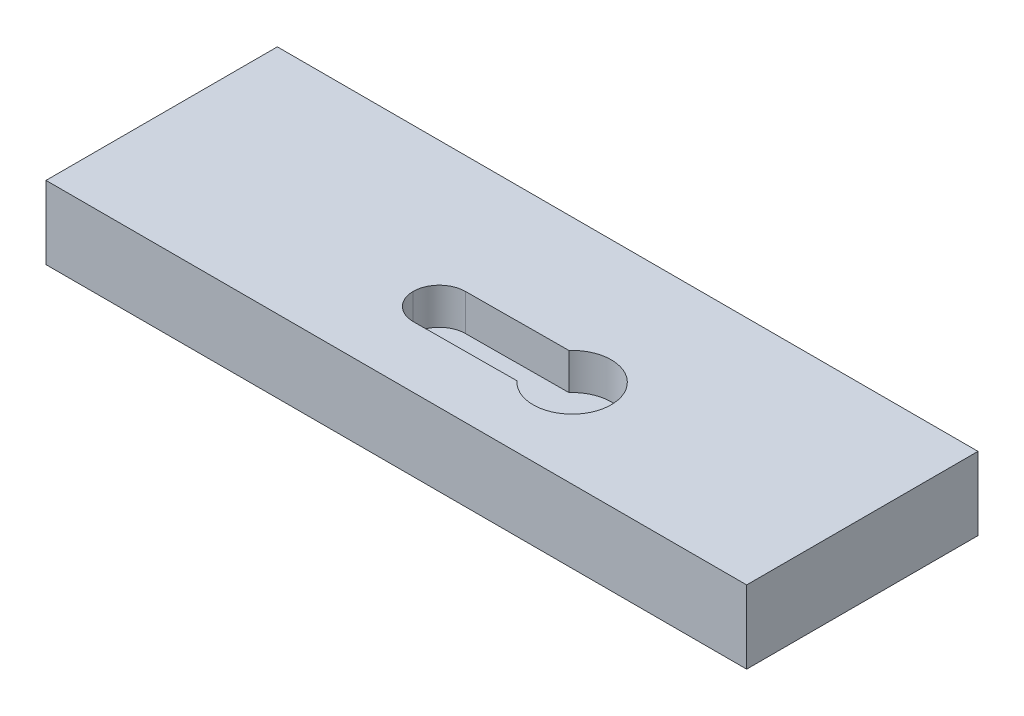
ISO-10303-21;
HEADER;
FILE_DESCRIPTION(('STEP AP214'),'2;1');
FILE_NAME('part.step','',(''),(''),'','','');
FILE_SCHEMA(('AUTOMOTIVE_DESIGN { 1 0 10303 214 1 1 1 1 }'));
ENDSEC;
DATA;
#1=APPLICATION_CONTEXT('core data for automotive mechanical design processes');
#2=APPLICATION_PROTOCOL_DEFINITION('international standard','automotive_design',2000,#1);
#3=PRODUCT_CONTEXT('',#1,'mechanical');
#4=PRODUCT('Part','Part','',(#3));
#5=PRODUCT_RELATED_PRODUCT_CATEGORY('part','',(#4));
#6=PRODUCT_DEFINITION_FORMATION('','',#4);
#7=PRODUCT_DEFINITION_CONTEXT('part definition',#1,'design');
#8=PRODUCT_DEFINITION('design','',#6,#7);
#9=PRODUCT_DEFINITION_SHAPE('','',#8);
#10=(LENGTH_UNIT() NAMED_UNIT(*) SI_UNIT(.MILLI.,.METRE.));
#11=(NAMED_UNIT(*) PLANE_ANGLE_UNIT() SI_UNIT($,.RADIAN.));
#12=(NAMED_UNIT(*) SI_UNIT($,.STERADIAN.) SOLID_ANGLE_UNIT());
#13=UNCERTAINTY_MEASURE_WITH_UNIT(LENGTH_MEASURE(1.E-05),#10,'distance_accuracy_value','');
#14=(GEOMETRIC_REPRESENTATION_CONTEXT(3) GLOBAL_UNCERTAINTY_ASSIGNED_CONTEXT((#13)) GLOBAL_UNIT_ASSIGNED_CONTEXT((#10,
#11,#12)) REPRESENTATION_CONTEXT('',''));
#15=CARTESIAN_POINT('',(0.,0.,0.));
#16=DIRECTION('',(0.,0.,1.));
#17=DIRECTION('',(1.,0.,0.));
#18=AXIS2_PLACEMENT_3D('',#15,#16,#17);
#19=CARTESIAN_POINT('',(-25.9444718568664,136.062650417628,50.3047637036188));
#20=DIRECTION('',(-1.,0.,0.));
#21=DIRECTION('',(0.,-1.,0.));
#22=AXIS2_PLACEMENT_3D('',#19,#20,#21);
#23=PLANE('',#22);
#24=DIRECTION('',(0.,0.,1.));
#25=VECTOR('',#24,1.);
#26=CARTESIAN_POINT('',(-25.9444718568664,136.062650417628,50.3047637036188));
#27=LINE('',#26,#25);
#28=CARTESIAN_POINT('',(-25.9444718568664,136.062650417628,45.474424917594));
#29=VERTEX_POINT('',#28);
#30=CARTESIAN_POINT('',(-25.9444718568664,136.062650417628,65.6009839618434));
#31=VERTEX_POINT('',#30);
#32=EDGE_CURVE('E147',#29,#31,#27,.T.);
#33=ORIENTED_EDGE('',*,*,#32,.T.);
#34=DIRECTION('',(0.,1.,0.));
#35=VECTOR('',#34,1.);
#36=CARTESIAN_POINT('',(-25.9444718568664,71.866077464224,65.6009839618434));
#37=LINE('',#36,#35);
#38=CARTESIAN_POINT('',(-25.9444718568664,142.412650417628,65.6009839618434));
#39=VERTEX_POINT('',#38);
#40=EDGE_CURVE('E151',#31,#39,#37,.T.);
#41=ORIENTED_EDGE('',*,*,#40,.T.);
#42=DIRECTION('',(0.,0.,1.));
#43=VECTOR('',#42,1.);
#44=CARTESIAN_POINT('',(-25.9444718568664,142.412650417628,45.474424917594));
#45=LINE('',#44,#43);
#46=CARTESIAN_POINT('',(-25.9444718568664,142.412650417628,45.474424917594));
#47=VERTEX_POINT('',#46);
#48=EDGE_CURVE('E111',#47,#39,#45,.T.);
#49=ORIENTED_EDGE('',*,*,#48,.F.);
#50=DIRECTION('',(0.,1.,0.));
#51=VECTOR('',#50,1.);
#52=CARTESIAN_POINT('',(-25.9444718568664,71.866077464224,45.474424917594));
#53=LINE('',#52,#51);
#54=EDGE_CURVE('E162',#29,#47,#53,.T.);
#55=ORIENTED_EDGE('',*,*,#54,.F.);
#56=EDGE_LOOP('',(#33,#41,#49,#55));
#57=FACE_BOUND('',#56,.T.);
#58=ADVANCED_FACE('F36',(#57),#23,.T.);
#59=CARTESIAN_POINT('',(1.49133014329351E-13,136.062650417627,0.));
#60=DIRECTION('',(0.,1.,0.));
#61=DIRECTION('',(-1.,0.,0.));
#62=AXIS2_PLACEMENT_3D('',#59,#60,#61);
#63=PLANE('',#62);
#64=DIRECTION('',(-1.,0.,0.));
#65=VECTOR('',#64,1.);
#66=CARTESIAN_POINT('',(-25.9444718568664,136.062650417628,65.6009839618434));
#67=LINE('',#66,#65);
#68=CARTESIAN_POINT('',(35.0155281431336,136.062650417627,65.6009839618434));
#69=VERTEX_POINT('',#68);
#70=EDGE_CURVE('E148',#69,#31,#67,.T.);
#71=ORIENTED_EDGE('',*,*,#70,.T.);
#72=ORIENTED_EDGE('',*,*,#32,.F.);
#73=DIRECTION('',(1.,0.,0.));
#74=VECTOR('',#73,1.);
#75=CARTESIAN_POINT('',(35.0155281431336,136.062650417627,45.474424917594));
#76=LINE('',#75,#74);
#77=CARTESIAN_POINT('',(35.0155281431336,136.062650417627,45.474424917594));
#78=VERTEX_POINT('',#77);
#79=EDGE_CURVE('E149',#29,#78,#76,.T.);
#80=ORIENTED_EDGE('',*,*,#79,.T.);
#81=DIRECTION('',(0.,0.,1.));
#82=VECTOR('',#81,1.);
#83=CARTESIAN_POINT('',(35.0155281431336,136.062650417627,65.6009839618434));
#84=LINE('',#83,#82);
#85=EDGE_CURVE('E145',#78,#69,#84,.T.);
#86=ORIENTED_EDGE('',*,*,#85,.T.);
#87=EDGE_LOOP('',(#71,#72,#80,#86));
#88=FACE_BOUND('',#87,.T.);
#89=ADVANCED_FACE('F193',(#88),#63,.F.);
#90=CARTESIAN_POINT('',(35.0155281431335,71.8660774642239,65.6009839618434));
#91=DIRECTION('',(1.,0.,0.));
#92=DIRECTION('',(0.,1.,0.));
#93=AXIS2_PLACEMENT_3D('',#90,#91,#92);
#94=PLANE('',#93);
#95=ORIENTED_EDGE('',*,*,#85,.F.);
#96=DIRECTION('',(0.,1.,0.));
#97=VECTOR('',#96,1.);
#98=CARTESIAN_POINT('',(35.0155281431335,71.8660774642239,45.474424917594));
#99=LINE('',#98,#97);
#100=CARTESIAN_POINT('',(35.0155281431336,142.412650417627,45.474424917594));
#101=VERTEX_POINT('',#100);
#102=EDGE_CURVE('E164',#78,#101,#99,.T.);
#103=ORIENTED_EDGE('',*,*,#102,.T.);
#104=DIRECTION('',(0.,0.,-1.));
#105=VECTOR('',#104,1.);
#106=CARTESIAN_POINT('',(35.0155281431336,142.412650417627,65.6009839618434));
#107=LINE('',#106,#105);
#108=CARTESIAN_POINT('',(35.0155281431336,142.412650417627,65.6009839618434));
#109=VERTEX_POINT('',#108);
#110=EDGE_CURVE('E137',#109,#101,#107,.T.);
#111=ORIENTED_EDGE('',*,*,#110,.F.);
#112=DIRECTION('',(0.,1.,0.));
#113=VECTOR('',#112,1.);
#114=CARTESIAN_POINT('',(35.0155281431335,71.8660774642239,65.6009839618434));
#115=LINE('',#114,#113);
#116=EDGE_CURVE('E155',#69,#109,#115,.T.);
#117=ORIENTED_EDGE('',*,*,#116,.F.);
#118=EDGE_LOOP('',(#95,#103,#111,#117));
#119=FACE_BOUND('',#118,.T.);
#120=ADVANCED_FACE('F198',(#119),#94,.T.);
#121=CARTESIAN_POINT('',(35.0155281431335,71.8660774642239,45.474424917594));
#122=DIRECTION('',(0.,0.,-1.));
#123=DIRECTION('',(-1.,0.,0.));
#124=AXIS2_PLACEMENT_3D('',#121,#122,#123);
#125=PLANE('',#124);
#126=ORIENTED_EDGE('',*,*,#79,.F.);
#127=ORIENTED_EDGE('',*,*,#54,.T.);
#128=DIRECTION('',(-1.,0.,0.));
#129=VECTOR('',#128,1.);
#130=CARTESIAN_POINT('',(35.0155281431336,142.412650417627,45.474424917594));
#131=LINE('',#130,#129);
#132=EDGE_CURVE('E140',#101,#47,#131,.T.);
#133=ORIENTED_EDGE('',*,*,#132,.F.);
#134=ORIENTED_EDGE('',*,*,#102,.F.);
#135=EDGE_LOOP('',(#126,#127,#133,#134));
#136=FACE_BOUND('',#135,.T.);
#137=ADVANCED_FACE('F215',(#136),#125,.T.);
#138=CARTESIAN_POINT('',(-25.9444718568664,71.866077464224,65.6009839618434));
#139=DIRECTION('',(0.,0.,1.));
#140=DIRECTION('',(1.,0.,0.));
#141=AXIS2_PLACEMENT_3D('',#138,#139,#140);
#142=PLANE('',#141);
#143=ORIENTED_EDGE('',*,*,#70,.F.);
#144=ORIENTED_EDGE('',*,*,#116,.T.);
#145=DIRECTION('',(1.,0.,0.));
#146=VECTOR('',#145,1.);
#147=CARTESIAN_POINT('',(-25.9444718568664,142.412650417628,65.6009839618434));
#148=LINE('',#147,#146);
#149=EDGE_CURVE('E134',#39,#109,#148,.T.);
#150=ORIENTED_EDGE('',*,*,#149,.F.);
#151=ORIENTED_EDGE('',*,*,#40,.F.);
#152=EDGE_LOOP('',(#143,#144,#150,#151));
#153=FACE_BOUND('',#152,.T.);
#154=ADVANCED_FACE('F190',(#153),#142,.T.);
#155=CARTESIAN_POINT('',(9.61725214157757,71.866077464224,55.6667861788358));
#156=DIRECTION('',(-0.00605286364702119,0.,-0.999981681253047));
#157=DIRECTION('',(-0.999981681253047,0.,0.00605286364702119));
#158=AXIS2_PLACEMENT_3D('',#155,#156,#157);
#159=PLANE('',#158);
#160=DIRECTION('',(-0.999981681253047,0.,0.00605286364702119));
#161=VECTOR('',#160,1.);
#162=CARTESIAN_POINT('',(0.337289642815836,139.237650417627,55.7229575554795));
#163=LINE('',#162,#161);
#164=CARTESIAN_POINT('',(9.61725214157761,139.237650417627,55.6667861788358));
#165=VERTEX_POINT('',#164);
#166=CARTESIAN_POINT('',(0.661178482074815,139.237650417627,55.720997064585));
#167=VERTEX_POINT('',#166);
#168=EDGE_CURVE('E11',#165,#167,#163,.T.);
#169=ORIENTED_EDGE('',*,*,#168,.F.);
#170=DIRECTION('',(0.,1.,0.));
#171=VECTOR('',#170,1.);
#172=CARTESIAN_POINT('',(9.61725214157757,71.866077464224,55.6667861788358));
#173=LINE('',#172,#171);
#174=CARTESIAN_POINT('',(9.61725214157761,142.412650417628,55.6667861788358));
#175=VERTEX_POINT('',#174);
#176=EDGE_CURVE('E50',#165,#175,#173,.T.);
#177=ORIENTED_EDGE('',*,*,#176,.T.);
#178=DIRECTION('',(-0.999981681253047,0.,0.00605286364702119));
#179=VECTOR('',#178,1.);
#180=CARTESIAN_POINT('',(9.61725214157761,142.412650417628,55.6667861788358));
#181=LINE('',#180,#179);
#182=CARTESIAN_POINT('',(0.661178482074816,142.412650417628,55.720997064585));
#183=VERTEX_POINT('',#182);
#184=EDGE_CURVE('E107',#175,#183,#181,.T.);
#185=ORIENTED_EDGE('',*,*,#184,.T.);
#186=DIRECTION('',(0.,1.,0.));
#187=VECTOR('',#186,1.);
#188=CARTESIAN_POINT('',(0.661178482074778,71.866077464224,55.720997064585));
#189=LINE('',#188,#187);
#190=EDGE_CURVE('E110',#167,#183,#189,.T.);
#191=ORIENTED_EDGE('',*,*,#190,.F.);
#192=EDGE_LOOP('',(#169,#177,#185,#191));
#193=FACE_BOUND('',#192,.T.);
#194=ADVANCED_FACE('F105',(#193),#159,.F.);
#195=CARTESIAN_POINT('',(0.675015328371866,71.866077464224,58.0069551879294));
#196=DIRECTION('',(0.,1.,0.));
#197=DIRECTION('',(-1.,0.,0.));
#198=AXIS2_PLACEMENT_3D('',#195,#196,#197);
#199=CYLINDRICAL_SURFACE('',#198,2.286);
#200=CARTESIAN_POINT('',(0.675015328371903,139.237650417627,58.0069551879294));
#201=DIRECTION('',(0.,1.,0.));
#202=DIRECTION('',(-1.,0.,0.));
#203=AXIS2_PLACEMENT_3D('',#200,#201,#202);
#204=CIRCLE('',#203,2.286);
#205=CARTESIAN_POINT('',(-1.61098438893714,139.237650417627,58.0080920533416));
#206=VERTEX_POINT('',#205);
#207=EDGE_CURVE('E43',#167,#206,#204,.T.);
#208=ORIENTED_EDGE('',*,*,#207,.F.);
#209=ORIENTED_EDGE('',*,*,#190,.T.);
#210=CARTESIAN_POINT('',(0.675015328371905,142.412650417628,58.0069551879294));
#211=DIRECTION('',(0.,1.,0.));
#212=DIRECTION('',(-1.,0.,0.));
#213=AXIS2_PLACEMENT_3D('',#210,#211,#212);
#214=CIRCLE('',#213,2.286);
#215=CARTESIAN_POINT('',(-1.61098438893714,142.412650417628,58.0080920533416));
#216=VERTEX_POINT('',#215);
#217=EDGE_CURVE('E125',#183,#216,#214,.T.);
#218=ORIENTED_EDGE('',*,*,#217,.T.);
#219=DIRECTION('',(0.,1.,0.));
#220=VECTOR('',#219,1.);
#221=CARTESIAN_POINT('',(-1.61098438893717,71.866077464224,58.0080920533416));
#222=LINE('',#221,#220);
#223=EDGE_CURVE('E158',#206,#216,#222,.T.);
#224=ORIENTED_EDGE('',*,*,#223,.F.);
#225=EDGE_LOOP('',(#208,#209,#218,#224));
#226=FACE_BOUND('',#225,.T.);
#227=ADVANCED_FACE('F182',(#226),#199,.F.);
#228=CARTESIAN_POINT('',(0.674861585635229,71.866077464224,57.9815556532256));
#229=DIRECTION('',(0.,1.,0.));
#230=DIRECTION('',(-1.,0.,0.));
#231=AXIS2_PLACEMENT_3D('',#228,#229,#230);
#232=CYLINDRICAL_SURFACE('',#231,2.286);
#233=CARTESIAN_POINT('',(0.674861585635266,139.237650417627,57.9815556532256));
#234=DIRECTION('',(0.,1.,0.));
#235=DIRECTION('',(-1.,0.,0.));
#236=AXIS2_PLACEMENT_3D('',#233,#234,#235);
#237=CIRCLE('',#236,2.286);
#238=CARTESIAN_POINT('',(0.688698431932357,139.237650417627,60.2675137765701));
#239=VERTEX_POINT('',#238);
#240=EDGE_CURVE('E173',#206,#239,#237,.T.);
#241=ORIENTED_EDGE('',*,*,#240,.F.);
#242=ORIENTED_EDGE('',*,*,#223,.T.);
#243=CARTESIAN_POINT('',(0.674861585635268,142.412650417628,57.9815556532256));
#244=DIRECTION('',(0.,1.,0.));
#245=DIRECTION('',(-1.,0.,0.));
#246=AXIS2_PLACEMENT_3D('',#243,#244,#245);
#247=CIRCLE('',#246,2.286);
#248=CARTESIAN_POINT('',(0.688698431932357,142.412650417628,60.2675137765701));
#249=VERTEX_POINT('',#248);
#250=EDGE_CURVE('E127',#216,#249,#247,.T.);
#251=ORIENTED_EDGE('',*,*,#250,.T.);
#252=DIRECTION('',(0.,1.,0.));
#253=VECTOR('',#252,1.);
#254=CARTESIAN_POINT('',(0.68869843193232,71.866077464224,60.2675137765701));
#255=LINE('',#254,#253);
#256=EDGE_CURVE('E156',#239,#249,#255,.T.);
#257=ORIENTED_EDGE('',*,*,#256,.F.);
#258=EDGE_LOOP('',(#241,#242,#251,#257));
#259=FACE_BOUND('',#258,.T.);
#260=ADVANCED_FACE('F181',(#259),#232,.F.);
#261=CARTESIAN_POINT('',(0.68869843193232,71.866077464224,60.2675137765701));
#262=DIRECTION('',(0.00605286364701964,0.,0.999981681253047));
#263=DIRECTION('',(0.999981681253047,0.,-0.00605286364701964));
#264=AXIS2_PLACEMENT_3D('',#261,#262,#263);
#265=PLANE('',#264);
#266=DIRECTION('',(0.999981681253047,0.,-0.00605286364701964));
#267=VECTOR('',#266,1.);
#268=CARTESIAN_POINT('',(0.364809592673289,139.237650417627,60.2694742674646));
#269=LINE('',#268,#267);
#270=CARTESIAN_POINT('',(9.64477209143515,139.237650417627,60.2133028908209));
#271=VERTEX_POINT('',#270);
#272=EDGE_CURVE('E170',#239,#271,#269,.T.);
#273=ORIENTED_EDGE('',*,*,#272,.F.);
#274=ORIENTED_EDGE('',*,*,#256,.T.);
#275=DIRECTION('',(0.999981681253047,0.,-0.00605286364701964));
#276=VECTOR('',#275,1.);
#277=CARTESIAN_POINT('',(0.688698431932359,142.412650417628,60.2675137765701));
#278=LINE('',#277,#276);
#279=CARTESIAN_POINT('',(9.64477209143515,142.412650417628,60.2133028908209));
#280=VERTEX_POINT('',#279);
#281=EDGE_CURVE('E132',#249,#280,#278,.T.);
#282=ORIENTED_EDGE('',*,*,#281,.T.);
#283=DIRECTION('',(0.,1.,0.));
#284=VECTOR('',#283,1.);
#285=CARTESIAN_POINT('',(9.64477209143511,71.866077464224,60.2133028908209));
#286=LINE('',#285,#284);
#287=EDGE_CURVE('E117',#271,#280,#286,.T.);
#288=ORIENTED_EDGE('',*,*,#287,.F.);
#289=EDGE_LOOP('',(#273,#274,#282,#288));
#290=FACE_BOUND('',#289,.T.);
#291=ADVANCED_FACE('F178',(#290),#265,.F.);
#292=CARTESIAN_POINT('',(12.1555281431335,71.866077464224,57.9247637036188));
#293=DIRECTION('',(0.,1.,0.));
#294=DIRECTION('',(-1.,0.,0.));
#295=AXIS2_PLACEMENT_3D('',#292,#293,#294);
#296=CYLINDRICAL_SURFACE('',#295,3.39725);
#297=CARTESIAN_POINT('',(12.1555281431336,139.237650417627,57.9247637036188));
#298=DIRECTION('',(0.,1.,0.));
#299=DIRECTION('',(-1.,0.,0.));
#300=AXIS2_PLACEMENT_3D('',#297,#298,#299);
#301=CIRCLE('',#300,3.39725);
#302=EDGE_CURVE('E168',#271,#165,#301,.T.);
#303=ORIENTED_EDGE('',*,*,#302,.F.);
#304=ORIENTED_EDGE('',*,*,#287,.T.);
#305=CARTESIAN_POINT('',(12.1555281431336,142.412650417628,57.9247637036188));
#306=DIRECTION('',(0.,1.,0.));
#307=DIRECTION('',(-1.,0.,0.));
#308=AXIS2_PLACEMENT_3D('',#305,#306,#307);
#309=CIRCLE('',#308,3.39725);
#310=EDGE_CURVE('E114',#280,#175,#309,.T.);
#311=ORIENTED_EDGE('',*,*,#310,.T.);
#312=ORIENTED_EDGE('',*,*,#176,.F.);
#313=EDGE_LOOP('',(#303,#304,#311,#312));
#314=FACE_BOUND('',#313,.T.);
#315=ADVANCED_FACE('F115',(#314),#296,.F.);
#316=CARTESIAN_POINT('',(1.28536390362482E-13,142.412650417628,0.));
#317=DIRECTION('',(0.,1.,0.));
#318=DIRECTION('',(-1.,0.,0.));
#319=AXIS2_PLACEMENT_3D('',#316,#317,#318);
#320=PLANE('',#319);
#321=ORIENTED_EDGE('',*,*,#149,.T.);
#322=ORIENTED_EDGE('',*,*,#110,.T.);
#323=ORIENTED_EDGE('',*,*,#132,.T.);
#324=ORIENTED_EDGE('',*,*,#48,.T.);
#325=EDGE_LOOP('',(#321,#322,#323,#324));
#326=FACE_BOUND('',#325,.T.);
#327=ORIENTED_EDGE('',*,*,#184,.F.);
#328=ORIENTED_EDGE('',*,*,#310,.F.);
#329=ORIENTED_EDGE('',*,*,#281,.F.);
#330=ORIENTED_EDGE('',*,*,#250,.F.);
#331=ORIENTED_EDGE('',*,*,#217,.F.);
#332=EDGE_LOOP('',(#327,#328,#329,#330,#331));
#333=FACE_BOUND('',#332,.T.);
#334=ADVANCED_FACE('F122',(#326,#333),#320,.T.);
#335=CARTESIAN_POINT('',(1.52150438374369E-13,139.237650417627,0.));
#336=DIRECTION('',(0.,1.,0.));
#337=DIRECTION('',(-1.,0.,0.));
#338=AXIS2_PLACEMENT_3D('',#335,#336,#337);
#339=PLANE('',#338);
#340=ORIENTED_EDGE('',*,*,#302,.T.);
#341=ORIENTED_EDGE('',*,*,#168,.T.);
#342=ORIENTED_EDGE('',*,*,#207,.T.);
#343=ORIENTED_EDGE('',*,*,#240,.T.);
#344=ORIENTED_EDGE('',*,*,#272,.T.);
#345=EDGE_LOOP('',(#340,#341,#342,#343,#344));
#346=FACE_BOUND('',#345,.T.);
#347=ADVANCED_FACE('F176',(#346),#339,.T.);
#348=CLOSED_SHELL('',(#58,#89,#120,#137,#154,#194,#227,#260,#291,#315,#334,#347));
#349=MANIFOLD_SOLID_BREP('B2',#348);
#350=ADVANCED_BREP_SHAPE_REPRESENTATION('',(#18,#349),#14);
#351=SHAPE_DEFINITION_REPRESENTATION(#9,#350);
ENDSEC;
END-ISO-10303-21;
